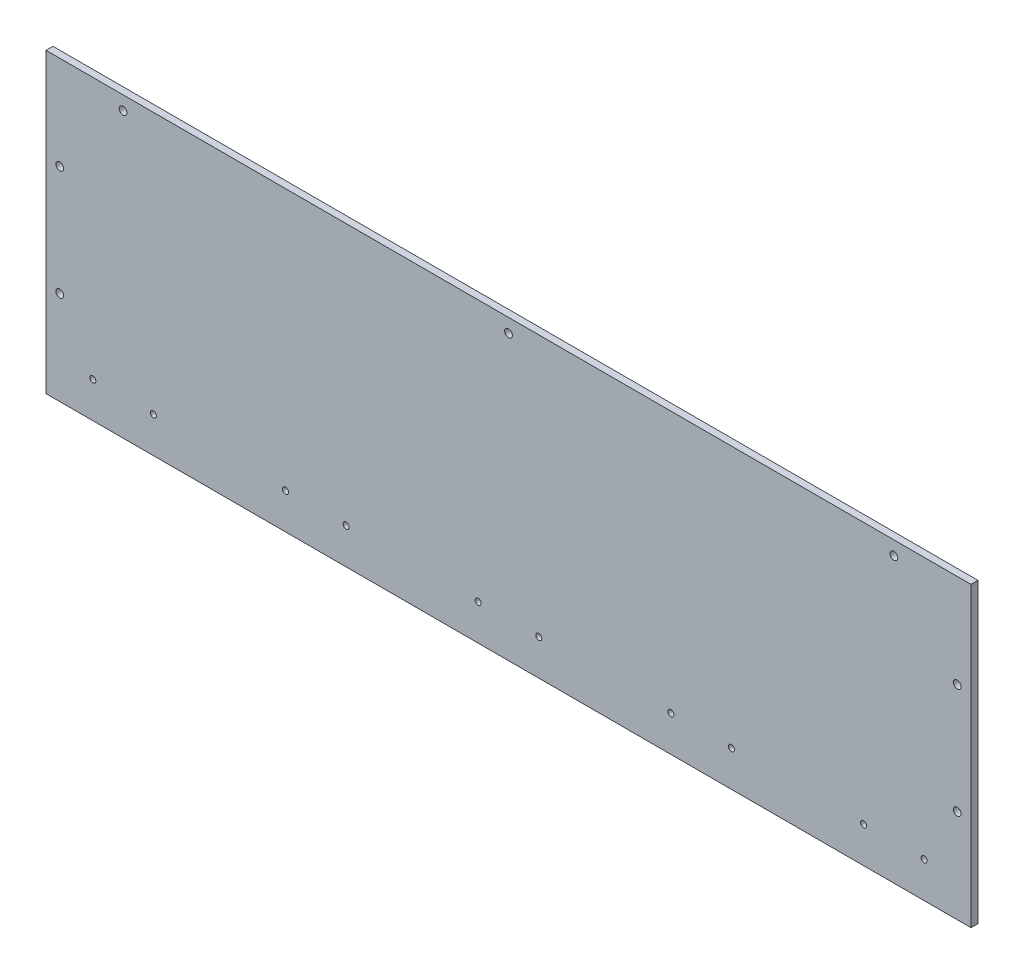
ISO-10303-21;
HEADER;
FILE_DESCRIPTION(('STEP AP214'),'2;1');
FILE_NAME('part.step','',(''),(''),'','','');
FILE_SCHEMA(('AUTOMOTIVE_DESIGN { 1 0 10303 214 1 1 1 1 }'));
ENDSEC;
DATA;
#1=APPLICATION_CONTEXT('core data for automotive mechanical design processes');
#2=APPLICATION_PROTOCOL_DEFINITION('international standard','automotive_design',2000,#1);
#3=PRODUCT_CONTEXT('',#1,'mechanical');
#4=PRODUCT('Part','Part','',(#3));
#5=PRODUCT_RELATED_PRODUCT_CATEGORY('part','',(#4));
#6=PRODUCT_DEFINITION_FORMATION('','',#4);
#7=PRODUCT_DEFINITION_CONTEXT('part definition',#1,'design');
#8=PRODUCT_DEFINITION('design','',#6,#7);
#9=PRODUCT_DEFINITION_SHAPE('','',#8);
#10=(LENGTH_UNIT() NAMED_UNIT(*) SI_UNIT(.MILLI.,.METRE.));
#11=(NAMED_UNIT(*) PLANE_ANGLE_UNIT() SI_UNIT($,.RADIAN.));
#12=(NAMED_UNIT(*) SI_UNIT($,.STERADIAN.) SOLID_ANGLE_UNIT());
#13=UNCERTAINTY_MEASURE_WITH_UNIT(LENGTH_MEASURE(1.E-05),#10,'distance_accuracy_value','');
#14=(GEOMETRIC_REPRESENTATION_CONTEXT(3) GLOBAL_UNCERTAINTY_ASSIGNED_CONTEXT((#13)) GLOBAL_UNIT_ASSIGNED_CONTEXT((#10,
#11,#12)) REPRESENTATION_CONTEXT('',''));
#15=CARTESIAN_POINT('',(0.,0.,0.));
#16=DIRECTION('',(0.,0.,1.));
#17=DIRECTION('',(1.,0.,0.));
#18=AXIS2_PLACEMENT_3D('',#15,#16,#17);
#19=CARTESIAN_POINT('',(0.,0.,6.35));
#20=DIRECTION('',(0.,0.,-1.));
#21=DIRECTION('',(-1.,0.,0.));
#22=AXIS2_PLACEMENT_3D('',#19,#20,#21);
#23=PLANE('',#22);
#24=CARTESIAN_POINT('',(420.,257.5,6.35));
#25=DIRECTION('',(0.,0.,-1.));
#26=DIRECTION('',(-1.,0.,0.));
#27=AXIS2_PLACEMENT_3D('',#24,#25,#26);
#28=CIRCLE('',#27,3.50000000000002);
#29=CARTESIAN_POINT('',(416.5,257.5,6.35));
#30=VERTEX_POINT('',#29);
#31=EDGE_CURVE('E103',#30,#30,#28,.T.);
#32=ORIENTED_EDGE('',*,*,#31,.T.);
#33=EDGE_LOOP('',(#32));
#34=FACE_BOUND('',#33,.T.);
#35=CARTESIAN_POINT('',(770.,257.5,6.35));
#36=DIRECTION('',(0.,0.,-1.));
#37=DIRECTION('',(-1.,0.,0.));
#38=AXIS2_PLACEMENT_3D('',#35,#36,#37);
#39=CIRCLE('',#38,3.49999999999997);
#40=CARTESIAN_POINT('',(766.5,257.5,6.35));
#41=VERTEX_POINT('',#40);
#42=EDGE_CURVE('E117',#41,#41,#39,.T.);
#43=ORIENTED_EDGE('',*,*,#42,.T.);
#44=EDGE_LOOP('',(#43));
#45=FACE_BOUND('',#44,.T.);
#46=CARTESIAN_POINT('',(12.5,185.,6.35));
#47=DIRECTION('',(0.,0.,-1.));
#48=DIRECTION('',(-1.,0.,0.));
#49=AXIS2_PLACEMENT_3D('',#46,#47,#48);
#50=CIRCLE('',#49,3.5);
#51=CARTESIAN_POINT('',(9.00000000000001,185.,6.35));
#52=VERTEX_POINT('',#51);
#53=EDGE_CURVE('E120',#52,#52,#50,.T.);
#54=ORIENTED_EDGE('',*,*,#53,.T.);
#55=EDGE_LOOP('',(#54));
#56=FACE_BOUND('',#55,.T.);
#57=CARTESIAN_POINT('',(12.5,85.,6.35));
#58=DIRECTION('',(0.,0.,-1.));
#59=DIRECTION('',(-1.,0.,0.));
#60=AXIS2_PLACEMENT_3D('',#57,#58,#59);
#61=CIRCLE('',#60,3.5);
#62=CARTESIAN_POINT('',(9.00000000000004,85.,6.35));
#63=VERTEX_POINT('',#62);
#64=EDGE_CURVE('E123',#63,#63,#61,.T.);
#65=ORIENTED_EDGE('',*,*,#64,.T.);
#66=EDGE_LOOP('',(#65));
#67=FACE_BOUND('',#66,.T.);
#68=CARTESIAN_POINT('',(392.5,32.5,6.35));
#69=DIRECTION('',(0.,0.,-1.));
#70=DIRECTION('',(-1.,0.,0.));
#71=AXIS2_PLACEMENT_3D('',#68,#69,#70);
#72=CIRCLE('',#71,2.74999999999998);
#73=CARTESIAN_POINT('',(389.75,32.5,6.35));
#74=VERTEX_POINT('',#73);
#75=EDGE_CURVE('E126',#74,#74,#72,.T.);
#76=ORIENTED_EDGE('',*,*,#75,.T.);
#77=EDGE_LOOP('',(#76));
#78=FACE_BOUND('',#77,.T.);
#79=CARTESIAN_POINT('',(447.5,32.5,6.35));
#80=DIRECTION('',(0.,0.,-1.));
#81=DIRECTION('',(-1.,0.,0.));
#82=AXIS2_PLACEMENT_3D('',#79,#80,#81);
#83=CIRCLE('',#82,2.74999999999998);
#84=CARTESIAN_POINT('',(444.75,32.5,6.35));
#85=VERTEX_POINT('',#84);
#86=EDGE_CURVE('E129',#85,#85,#83,.T.);
#87=ORIENTED_EDGE('',*,*,#86,.T.);
#88=EDGE_LOOP('',(#87));
#89=FACE_BOUND('',#88,.T.);
#90=CARTESIAN_POINT('',(567.5,32.5,6.35));
#91=DIRECTION('',(0.,0.,-1.));
#92=DIRECTION('',(-1.,0.,0.));
#93=AXIS2_PLACEMENT_3D('',#90,#91,#92);
#94=CIRCLE('',#93,2.75000000000004);
#95=CARTESIAN_POINT('',(564.75,32.5,6.35));
#96=VERTEX_POINT('',#95);
#97=EDGE_CURVE('E132',#96,#96,#94,.T.);
#98=ORIENTED_EDGE('',*,*,#97,.T.);
#99=EDGE_LOOP('',(#98));
#100=FACE_BOUND('',#99,.T.);
#101=CARTESIAN_POINT('',(622.5,32.5,6.35));
#102=DIRECTION('',(0.,0.,-1.));
#103=DIRECTION('',(-1.,0.,0.));
#104=AXIS2_PLACEMENT_3D('',#101,#102,#103);
#105=CIRCLE('',#104,2.74999999999992);
#106=CARTESIAN_POINT('',(619.75,32.5,6.35));
#107=VERTEX_POINT('',#106);
#108=EDGE_CURVE('E135',#107,#107,#105,.T.);
#109=ORIENTED_EDGE('',*,*,#108,.T.);
#110=EDGE_LOOP('',(#109));
#111=FACE_BOUND('',#110,.T.);
#112=CARTESIAN_POINT('',(742.5,32.5,6.35));
#113=DIRECTION('',(0.,0.,-1.));
#114=DIRECTION('',(-1.,0.,0.));
#115=AXIS2_PLACEMENT_3D('',#112,#113,#114);
#116=CIRCLE('',#115,2.75000000000004);
#117=CARTESIAN_POINT('',(739.75,32.5,6.35));
#118=VERTEX_POINT('',#117);
#119=EDGE_CURVE('E138',#118,#118,#116,.T.);
#120=ORIENTED_EDGE('',*,*,#119,.T.);
#121=EDGE_LOOP('',(#120));
#122=FACE_BOUND('',#121,.T.);
#123=CARTESIAN_POINT('',(797.5,32.5,6.35));
#124=DIRECTION('',(0.,0.,-1.));
#125=DIRECTION('',(-1.,0.,0.));
#126=AXIS2_PLACEMENT_3D('',#123,#124,#125);
#127=CIRCLE('',#126,2.74999999999992);
#128=CARTESIAN_POINT('',(794.75,32.5,6.35));
#129=VERTEX_POINT('',#128);
#130=EDGE_CURVE('E141',#129,#129,#127,.T.);
#131=ORIENTED_EDGE('',*,*,#130,.T.);
#132=EDGE_LOOP('',(#131));
#133=FACE_BOUND('',#132,.T.);
#134=CARTESIAN_POINT('',(217.5,32.4999999999988,6.35));
#135=DIRECTION('',(0.,0.,-1.));
#136=DIRECTION('',(-1.,0.,0.));
#137=AXIS2_PLACEMENT_3D('',#134,#135,#136);
#138=CIRCLE('',#137,2.74999999999998);
#139=CARTESIAN_POINT('',(214.75,32.4999999999988,6.35));
#140=VERTEX_POINT('',#139);
#141=EDGE_CURVE('E144',#140,#140,#138,.T.);
#142=ORIENTED_EDGE('',*,*,#141,.T.);
#143=EDGE_LOOP('',(#142));
#144=FACE_BOUND('',#143,.T.);
#145=CARTESIAN_POINT('',(272.5,32.4999999999988,6.35));
#146=DIRECTION('',(0.,0.,-1.));
#147=DIRECTION('',(-1.,0.,0.));
#148=AXIS2_PLACEMENT_3D('',#145,#146,#147);
#149=CIRCLE('',#148,2.74999999999998);
#150=CARTESIAN_POINT('',(269.75,32.4999999999988,6.35));
#151=VERTEX_POINT('',#150);
#152=EDGE_CURVE('E147',#151,#151,#149,.T.);
#153=ORIENTED_EDGE('',*,*,#152,.T.);
#154=EDGE_LOOP('',(#153));
#155=FACE_BOUND('',#154,.T.);
#156=CARTESIAN_POINT('',(42.5,32.4999999999976,6.35));
#157=DIRECTION('',(0.,0.,-1.));
#158=DIRECTION('',(-1.,0.,0.));
#159=AXIS2_PLACEMENT_3D('',#156,#157,#158);
#160=CIRCLE('',#159,2.74999999999998);
#161=CARTESIAN_POINT('',(39.7500000000001,32.4999999999976,6.35));
#162=VERTEX_POINT('',#161);
#163=EDGE_CURVE('E150',#162,#162,#160,.T.);
#164=ORIENTED_EDGE('',*,*,#163,.T.);
#165=EDGE_LOOP('',(#164));
#166=FACE_BOUND('',#165,.T.);
#167=CARTESIAN_POINT('',(97.5000000000001,32.4999999999976,6.35));
#168=DIRECTION('',(0.,0.,-1.));
#169=DIRECTION('',(-1.,0.,0.));
#170=AXIS2_PLACEMENT_3D('',#167,#168,#169);
#171=CIRCLE('',#170,2.74999999999998);
#172=CARTESIAN_POINT('',(94.7500000000001,32.4999999999976,6.35));
#173=VERTEX_POINT('',#172);
#174=EDGE_CURVE('E153',#173,#173,#171,.T.);
#175=ORIENTED_EDGE('',*,*,#174,.T.);
#176=EDGE_LOOP('',(#175));
#177=FACE_BOUND('',#176,.T.);
#178=CARTESIAN_POINT('',(70.,257.5,6.35));
#179=DIRECTION('',(0.,0.,-1.));
#180=DIRECTION('',(-1.,0.,0.));
#181=AXIS2_PLACEMENT_3D('',#178,#179,#180);
#182=CIRCLE('',#181,3.50000000000001);
#183=CARTESIAN_POINT('',(66.5,257.5,6.35));
#184=VERTEX_POINT('',#183);
#185=EDGE_CURVE('E156',#184,#184,#182,.T.);
#186=ORIENTED_EDGE('',*,*,#185,.T.);
#187=EDGE_LOOP('',(#186));
#188=FACE_BOUND('',#187,.T.);
#189=DIRECTION('',(0.,-1.,0.));
#190=VECTOR('',#189,1.);
#191=CARTESIAN_POINT('',(0.,0.,6.35));
#192=LINE('',#191,#190);
#193=CARTESIAN_POINT('',(0.,270.,6.35));
#194=VERTEX_POINT('',#193);
#195=CARTESIAN_POINT('',(0.,0.,6.35));
#196=VERTEX_POINT('',#195);
#197=EDGE_CURVE('E88',#194,#196,#192,.T.);
#198=ORIENTED_EDGE('',*,*,#197,.T.);
#199=DIRECTION('',(1.,0.,0.));
#200=VECTOR('',#199,1.);
#201=CARTESIAN_POINT('',(0.,0.,6.35));
#202=LINE('',#201,#200);
#203=CARTESIAN_POINT('',(840.,0.,6.35));
#204=VERTEX_POINT('',#203);
#205=EDGE_CURVE('E83',#196,#204,#202,.T.);
#206=ORIENTED_EDGE('',*,*,#205,.T.);
#207=DIRECTION('',(0.,1.,0.));
#208=VECTOR('',#207,1.);
#209=CARTESIAN_POINT('',(840.,0.,6.35));
#210=LINE('',#209,#208);
#211=CARTESIAN_POINT('',(840.,270.,6.35));
#212=VERTEX_POINT('',#211);
#213=EDGE_CURVE('E86',#204,#212,#210,.T.);
#214=ORIENTED_EDGE('',*,*,#213,.T.);
#215=DIRECTION('',(-1.,0.,0.));
#216=VECTOR('',#215,1.);
#217=CARTESIAN_POINT('',(0.,270.,6.35));
#218=LINE('',#217,#216);
#219=EDGE_CURVE('E53',#212,#194,#218,.T.);
#220=ORIENTED_EDGE('',*,*,#219,.T.);
#221=EDGE_LOOP('',(#198,#206,#214,#220));
#222=FACE_BOUND('',#221,.T.);
#223=CARTESIAN_POINT('',(827.5,85.,6.35));
#224=DIRECTION('',(0.,0.,-1.));
#225=DIRECTION('',(-1.,0.,0.));
#226=AXIS2_PLACEMENT_3D('',#223,#224,#225);
#227=CIRCLE('',#226,3.5);
#228=CARTESIAN_POINT('',(824.,85.,6.35));
#229=VERTEX_POINT('',#228);
#230=EDGE_CURVE('E207',#229,#229,#227,.F.);
#231=ORIENTED_EDGE('',*,*,#230,.F.);
#232=EDGE_LOOP('',(#231));
#233=FACE_BOUND('',#232,.T.);
#234=CARTESIAN_POINT('',(827.5,185.,6.35));
#235=DIRECTION('',(0.,0.,-1.));
#236=DIRECTION('',(-1.,0.,0.));
#237=AXIS2_PLACEMENT_3D('',#234,#235,#236);
#238=CIRCLE('',#237,3.5);
#239=CARTESIAN_POINT('',(824.,185.,6.35));
#240=VERTEX_POINT('',#239);
#241=EDGE_CURVE('E191',#240,#240,#238,.F.);
#242=ORIENTED_EDGE('',*,*,#241,.F.);
#243=EDGE_LOOP('',(#242));
#244=FACE_BOUND('',#243,.T.);
#245=ADVANCED_FACE('F36',(#34,#45,#56,#67,#78,#89,#100,#111,#122,#133,#144,#155,#166,#177,#188,
#222,#233,#244),#23,.F.);
#246=CARTESIAN_POINT('',(0.,0.,0.));
#247=DIRECTION('',(0.,0.,-1.));
#248=DIRECTION('',(-1.,0.,0.));
#249=AXIS2_PLACEMENT_3D('',#246,#247,#248);
#250=PLANE('',#249);
#251=CARTESIAN_POINT('',(827.5,85.,0.));
#252=DIRECTION('',(0.,0.,-1.));
#253=DIRECTION('',(-1.,0.,0.));
#254=AXIS2_PLACEMENT_3D('',#251,#252,#253);
#255=CIRCLE('',#254,3.5);
#256=CARTESIAN_POINT('',(824.,85.,0.));
#257=VERTEX_POINT('',#256);
#258=EDGE_CURVE('E211',#257,#257,#255,.T.);
#259=ORIENTED_EDGE('',*,*,#258,.F.);
#260=EDGE_LOOP('',(#259));
#261=FACE_BOUND('',#260,.T.);
#262=CARTESIAN_POINT('',(420.,257.5,0.));
#263=DIRECTION('',(0.,0.,1.));
#264=DIRECTION('',(1.,0.,0.));
#265=AXIS2_PLACEMENT_3D('',#262,#263,#264);
#266=CIRCLE('',#265,3.50000000000002);
#267=CARTESIAN_POINT('',(423.5,257.5,0.));
#268=VERTEX_POINT('',#267);
#269=EDGE_CURVE('E162',#268,#268,#266,.T.);
#270=ORIENTED_EDGE('',*,*,#269,.T.);
#271=EDGE_LOOP('',(#270));
#272=FACE_BOUND('',#271,.T.);
#273=CARTESIAN_POINT('',(770.,257.5,0.));
#274=DIRECTION('',(0.,0.,1.));
#275=DIRECTION('',(1.,0.,0.));
#276=AXIS2_PLACEMENT_3D('',#273,#274,#275);
#277=CIRCLE('',#276,3.49999999999997);
#278=CARTESIAN_POINT('',(773.5,257.5,0.));
#279=VERTEX_POINT('',#278);
#280=EDGE_CURVE('E182',#279,#279,#277,.T.);
#281=ORIENTED_EDGE('',*,*,#280,.T.);
#282=EDGE_LOOP('',(#281));
#283=FACE_BOUND('',#282,.T.);
#284=CARTESIAN_POINT('',(12.5,185.,0.));
#285=DIRECTION('',(0.,0.,1.));
#286=DIRECTION('',(1.,0.,0.));
#287=AXIS2_PLACEMENT_3D('',#284,#285,#286);
#288=CIRCLE('',#287,3.5);
#289=CARTESIAN_POINT('',(16.,185.,0.));
#290=VERTEX_POINT('',#289);
#291=EDGE_CURVE('E179',#290,#290,#288,.T.);
#292=ORIENTED_EDGE('',*,*,#291,.T.);
#293=EDGE_LOOP('',(#292));
#294=FACE_BOUND('',#293,.T.);
#295=CARTESIAN_POINT('',(12.5,85.,0.));
#296=DIRECTION('',(0.,0.,1.));
#297=DIRECTION('',(1.,0.,0.));
#298=AXIS2_PLACEMENT_3D('',#295,#296,#297);
#299=CIRCLE('',#298,3.5);
#300=CARTESIAN_POINT('',(16.,85.,0.));
#301=VERTEX_POINT('',#300);
#302=EDGE_CURVE('E176',#301,#301,#299,.T.);
#303=ORIENTED_EDGE('',*,*,#302,.T.);
#304=EDGE_LOOP('',(#303));
#305=FACE_BOUND('',#304,.T.);
#306=CARTESIAN_POINT('',(392.5,32.5,0.));
#307=DIRECTION('',(0.,0.,1.));
#308=DIRECTION('',(1.,0.,0.));
#309=AXIS2_PLACEMENT_3D('',#306,#307,#308);
#310=CIRCLE('',#309,2.74999999999998);
#311=CARTESIAN_POINT('',(395.25,32.5,0.));
#312=VERTEX_POINT('',#311);
#313=EDGE_CURVE('E173',#312,#312,#310,.T.);
#314=ORIENTED_EDGE('',*,*,#313,.T.);
#315=EDGE_LOOP('',(#314));
#316=FACE_BOUND('',#315,.T.);
#317=CARTESIAN_POINT('',(447.5,32.5,0.));
#318=DIRECTION('',(0.,0.,1.));
#319=DIRECTION('',(1.,0.,0.));
#320=AXIS2_PLACEMENT_3D('',#317,#318,#319);
#321=CIRCLE('',#320,2.74999999999998);
#322=CARTESIAN_POINT('',(450.25,32.5,0.));
#323=VERTEX_POINT('',#322);
#324=EDGE_CURVE('E170',#323,#323,#321,.T.);
#325=ORIENTED_EDGE('',*,*,#324,.T.);
#326=EDGE_LOOP('',(#325));
#327=FACE_BOUND('',#326,.T.);
#328=CARTESIAN_POINT('',(567.5,32.5,0.));
#329=DIRECTION('',(0.,0.,1.));
#330=DIRECTION('',(1.,0.,0.));
#331=AXIS2_PLACEMENT_3D('',#328,#329,#330);
#332=CIRCLE('',#331,2.75000000000004);
#333=CARTESIAN_POINT('',(570.25,32.5,0.));
#334=VERTEX_POINT('',#333);
#335=EDGE_CURVE('E166',#334,#334,#332,.T.);
#336=ORIENTED_EDGE('',*,*,#335,.T.);
#337=EDGE_LOOP('',(#336));
#338=FACE_BOUND('',#337,.T.);
#339=CARTESIAN_POINT('',(622.5,32.5,0.));
#340=DIRECTION('',(0.,0.,1.));
#341=DIRECTION('',(1.,0.,0.));
#342=AXIS2_PLACEMENT_3D('',#339,#340,#341);
#343=CIRCLE('',#342,2.74999999999992);
#344=CARTESIAN_POINT('',(625.25,32.5,0.));
#345=VERTEX_POINT('',#344);
#346=EDGE_CURVE('E163',#345,#345,#343,.T.);
#347=ORIENTED_EDGE('',*,*,#346,.T.);
#348=EDGE_LOOP('',(#347));
#349=FACE_BOUND('',#348,.T.);
#350=CARTESIAN_POINT('',(742.5,32.5,0.));
#351=DIRECTION('',(0.,0.,1.));
#352=DIRECTION('',(1.,0.,0.));
#353=AXIS2_PLACEMENT_3D('',#350,#351,#352);
#354=CIRCLE('',#353,2.75000000000004);
#355=CARTESIAN_POINT('',(745.25,32.5,0.));
#356=VERTEX_POINT('',#355);
#357=EDGE_CURVE('E167',#356,#356,#354,.T.);
#358=ORIENTED_EDGE('',*,*,#357,.T.);
#359=EDGE_LOOP('',(#358));
#360=FACE_BOUND('',#359,.T.);
#361=CARTESIAN_POINT('',(797.5,32.5,0.));
#362=DIRECTION('',(0.,0.,1.));
#363=DIRECTION('',(1.,0.,0.));
#364=AXIS2_PLACEMENT_3D('',#361,#362,#363);
#365=CIRCLE('',#364,2.74999999999992);
#366=CARTESIAN_POINT('',(800.25,32.5,0.));
#367=VERTEX_POINT('',#366);
#368=EDGE_CURVE('E200',#367,#367,#365,.T.);
#369=ORIENTED_EDGE('',*,*,#368,.T.);
#370=EDGE_LOOP('',(#369));
#371=FACE_BOUND('',#370,.T.);
#372=CARTESIAN_POINT('',(217.5,32.4999999999988,0.));
#373=DIRECTION('',(0.,0.,1.));
#374=DIRECTION('',(1.,0.,0.));
#375=AXIS2_PLACEMENT_3D('',#372,#373,#374);
#376=CIRCLE('',#375,2.74999999999998);
#377=CARTESIAN_POINT('',(220.25,32.4999999999988,0.));
#378=VERTEX_POINT('',#377);
#379=EDGE_CURVE('E197',#378,#378,#376,.T.);
#380=ORIENTED_EDGE('',*,*,#379,.T.);
#381=EDGE_LOOP('',(#380));
#382=FACE_BOUND('',#381,.T.);
#383=CARTESIAN_POINT('',(272.5,32.4999999999988,0.));
#384=DIRECTION('',(0.,0.,1.));
#385=DIRECTION('',(1.,0.,0.));
#386=AXIS2_PLACEMENT_3D('',#383,#384,#385);
#387=CIRCLE('',#386,2.74999999999998);
#388=CARTESIAN_POINT('',(275.25,32.4999999999988,0.));
#389=VERTEX_POINT('',#388);
#390=EDGE_CURVE('E194',#389,#389,#387,.T.);
#391=ORIENTED_EDGE('',*,*,#390,.T.);
#392=EDGE_LOOP('',(#391));
#393=FACE_BOUND('',#392,.T.);
#394=CARTESIAN_POINT('',(42.5,32.4999999999976,0.));
#395=DIRECTION('',(0.,0.,1.));
#396=DIRECTION('',(1.,0.,0.));
#397=AXIS2_PLACEMENT_3D('',#394,#395,#396);
#398=CIRCLE('',#397,2.74999999999998);
#399=CARTESIAN_POINT('',(45.25,32.4999999999976,0.));
#400=VERTEX_POINT('',#399);
#401=EDGE_CURVE('E190',#400,#400,#398,.T.);
#402=ORIENTED_EDGE('',*,*,#401,.T.);
#403=EDGE_LOOP('',(#402));
#404=FACE_BOUND('',#403,.T.);
#405=CARTESIAN_POINT('',(97.5000000000001,32.4999999999976,0.));
#406=DIRECTION('',(0.,0.,1.));
#407=DIRECTION('',(1.,0.,0.));
#408=AXIS2_PLACEMENT_3D('',#405,#406,#407);
#409=CIRCLE('',#408,2.74999999999998);
#410=CARTESIAN_POINT('',(100.25,32.4999999999976,0.));
#411=VERTEX_POINT('',#410);
#412=EDGE_CURVE('E187',#411,#411,#409,.T.);
#413=ORIENTED_EDGE('',*,*,#412,.T.);
#414=EDGE_LOOP('',(#413));
#415=FACE_BOUND('',#414,.T.);
#416=CARTESIAN_POINT('',(70.,257.5,0.));
#417=DIRECTION('',(0.,0.,1.));
#418=DIRECTION('',(1.,0.,0.));
#419=AXIS2_PLACEMENT_3D('',#416,#417,#418);
#420=CIRCLE('',#419,3.50000000000001);
#421=CARTESIAN_POINT('',(73.5,257.5,0.));
#422=VERTEX_POINT('',#421);
#423=EDGE_CURVE('E159',#422,#422,#420,.T.);
#424=ORIENTED_EDGE('',*,*,#423,.T.);
#425=EDGE_LOOP('',(#424));
#426=FACE_BOUND('',#425,.T.);
#427=DIRECTION('',(0.,-1.,0.));
#428=VECTOR('',#427,1.);
#429=CARTESIAN_POINT('',(0.,0.,0.));
#430=LINE('',#429,#428);
#431=CARTESIAN_POINT('',(0.,270.,0.));
#432=VERTEX_POINT('',#431);
#433=CARTESIAN_POINT('',(0.,0.,0.));
#434=VERTEX_POINT('',#433);
#435=EDGE_CURVE('E100',#432,#434,#430,.T.);
#436=ORIENTED_EDGE('',*,*,#435,.F.);
#437=DIRECTION('',(-1.,0.,0.));
#438=VECTOR('',#437,1.);
#439=CARTESIAN_POINT('',(0.,270.,0.));
#440=LINE('',#439,#438);
#441=CARTESIAN_POINT('',(840.,270.,0.));
#442=VERTEX_POINT('',#441);
#443=EDGE_CURVE('E76',#442,#432,#440,.T.);
#444=ORIENTED_EDGE('',*,*,#443,.F.);
#445=DIRECTION('',(0.,1.,0.));
#446=VECTOR('',#445,1.);
#447=CARTESIAN_POINT('',(840.,0.,0.));
#448=LINE('',#447,#446);
#449=CARTESIAN_POINT('',(840.,0.,0.));
#450=VERTEX_POINT('',#449);
#451=EDGE_CURVE('E70',#450,#442,#448,.T.);
#452=ORIENTED_EDGE('',*,*,#451,.F.);
#453=DIRECTION('',(1.,0.,0.));
#454=VECTOR('',#453,1.);
#455=CARTESIAN_POINT('',(0.,0.,0.));
#456=LINE('',#455,#454);
#457=EDGE_CURVE('E92',#434,#450,#456,.T.);
#458=ORIENTED_EDGE('',*,*,#457,.F.);
#459=EDGE_LOOP('',(#436,#444,#452,#458));
#460=FACE_BOUND('',#459,.T.);
#461=CARTESIAN_POINT('',(827.5,185.,0.));
#462=DIRECTION('',(0.,0.,-1.));
#463=DIRECTION('',(-1.,0.,0.));
#464=AXIS2_PLACEMENT_3D('',#461,#462,#463);
#465=CIRCLE('',#464,3.5);
#466=CARTESIAN_POINT('',(824.,185.,0.));
#467=VERTEX_POINT('',#466);
#468=EDGE_CURVE('E210',#467,#467,#465,.T.);
#469=ORIENTED_EDGE('',*,*,#468,.F.);
#470=EDGE_LOOP('',(#469));
#471=FACE_BOUND('',#470,.T.);
#472=ADVANCED_FACE('F111',(#261,#272,#283,#294,#305,#316,#327,#338,#349,#360,#371,#382,#393,
#404,#415,#426,#460,#471),#250,.T.);
#473=CARTESIAN_POINT('',(0.,0.,6.35));
#474=DIRECTION('',(1.,0.,0.));
#475=DIRECTION('',(0.,0.,-1.));
#476=AXIS2_PLACEMENT_3D('',#473,#474,#475);
#477=PLANE('',#476);
#478=ORIENTED_EDGE('',*,*,#435,.T.);
#479=DIRECTION('',(0.,0.,-1.));
#480=VECTOR('',#479,1.);
#481=CARTESIAN_POINT('',(0.,0.,6.35));
#482=LINE('',#481,#480);
#483=EDGE_CURVE('E11',#196,#434,#482,.T.);
#484=ORIENTED_EDGE('',*,*,#483,.F.);
#485=ORIENTED_EDGE('',*,*,#197,.F.);
#486=DIRECTION('',(0.,0.,-1.));
#487=VECTOR('',#486,1.);
#488=CARTESIAN_POINT('',(0.,270.,6.35));
#489=LINE('',#488,#487);
#490=EDGE_CURVE('E96',#194,#432,#489,.T.);
#491=ORIENTED_EDGE('',*,*,#490,.T.);
#492=EDGE_LOOP('',(#478,#484,#485,#491));
#493=FACE_BOUND('',#492,.T.);
#494=ADVANCED_FACE('F38',(#493),#477,.F.);
#495=CARTESIAN_POINT('',(0.,0.,6.35));
#496=DIRECTION('',(0.,1.,0.));
#497=DIRECTION('',(0.,0.,1.));
#498=AXIS2_PLACEMENT_3D('',#495,#496,#497);
#499=PLANE('',#498);
#500=ORIENTED_EDGE('',*,*,#457,.T.);
#501=DIRECTION('',(0.,0.,-1.));
#502=VECTOR('',#501,1.);
#503=CARTESIAN_POINT('',(840.,0.,6.35));
#504=LINE('',#503,#502);
#505=EDGE_CURVE('E45',#204,#450,#504,.T.);
#506=ORIENTED_EDGE('',*,*,#505,.F.);
#507=ORIENTED_EDGE('',*,*,#205,.F.);
#508=ORIENTED_EDGE('',*,*,#483,.T.);
#509=EDGE_LOOP('',(#500,#506,#507,#508));
#510=FACE_BOUND('',#509,.T.);
#511=ADVANCED_FACE('F91',(#510),#499,.F.);
#512=CARTESIAN_POINT('',(840.,0.,6.35));
#513=DIRECTION('',(-1.,0.,0.));
#514=DIRECTION('',(0.,0.,1.));
#515=AXIS2_PLACEMENT_3D('',#512,#513,#514);
#516=PLANE('',#515);
#517=ORIENTED_EDGE('',*,*,#451,.T.);
#518=DIRECTION('',(0.,0.,-1.));
#519=VECTOR('',#518,1.);
#520=CARTESIAN_POINT('',(840.,270.,6.35));
#521=LINE('',#520,#519);
#522=EDGE_CURVE('E93',#212,#442,#521,.T.);
#523=ORIENTED_EDGE('',*,*,#522,.F.);
#524=ORIENTED_EDGE('',*,*,#213,.F.);
#525=ORIENTED_EDGE('',*,*,#505,.T.);
#526=EDGE_LOOP('',(#517,#523,#524,#525));
#527=FACE_BOUND('',#526,.T.);
#528=ADVANCED_FACE('F94',(#527),#516,.F.);
#529=CARTESIAN_POINT('',(0.,270.,6.35));
#530=DIRECTION('',(0.,-1.,0.));
#531=DIRECTION('',(0.,0.,-1.));
#532=AXIS2_PLACEMENT_3D('',#529,#530,#531);
#533=PLANE('',#532);
#534=ORIENTED_EDGE('',*,*,#443,.T.);
#535=ORIENTED_EDGE('',*,*,#490,.F.);
#536=ORIENTED_EDGE('',*,*,#219,.F.);
#537=ORIENTED_EDGE('',*,*,#522,.T.);
#538=EDGE_LOOP('',(#534,#535,#536,#537));
#539=FACE_BOUND('',#538,.T.);
#540=ADVANCED_FACE('F108',(#539),#533,.F.);
#541=CARTESIAN_POINT('',(70.,257.5,0.));
#542=DIRECTION('',(0.,0.,1.));
#543=DIRECTION('',(1.,0.,0.));
#544=AXIS2_PLACEMENT_3D('',#541,#542,#543);
#545=CYLINDRICAL_SURFACE('',#544,3.50000000000001);
#546=ORIENTED_EDGE('',*,*,#423,.F.);
#547=EDGE_LOOP('',(#546));
#548=FACE_BOUND('',#547,.T.);
#549=ORIENTED_EDGE('',*,*,#185,.F.);
#550=EDGE_LOOP('',(#549));
#551=FACE_BOUND('',#550,.T.);
#552=ADVANCED_FACE('F234',(#548,#551),#545,.F.);
#553=CARTESIAN_POINT('',(97.5000000000001,32.4999999999976,0.));
#554=DIRECTION('',(0.,0.,1.));
#555=DIRECTION('',(1.,0.,0.));
#556=AXIS2_PLACEMENT_3D('',#553,#554,#555);
#557=CYLINDRICAL_SURFACE('',#556,2.74999999999998);
#558=ORIENTED_EDGE('',*,*,#412,.F.);
#559=EDGE_LOOP('',(#558));
#560=FACE_BOUND('',#559,.T.);
#561=ORIENTED_EDGE('',*,*,#174,.F.);
#562=EDGE_LOOP('',(#561));
#563=FACE_BOUND('',#562,.T.);
#564=ADVANCED_FACE('F255',(#560,#563),#557,.F.);
#565=CARTESIAN_POINT('',(42.5,32.4999999999976,0.));
#566=DIRECTION('',(0.,0.,1.));
#567=DIRECTION('',(1.,0.,0.));
#568=AXIS2_PLACEMENT_3D('',#565,#566,#567);
#569=CYLINDRICAL_SURFACE('',#568,2.74999999999998);
#570=ORIENTED_EDGE('',*,*,#401,.F.);
#571=EDGE_LOOP('',(#570));
#572=FACE_BOUND('',#571,.T.);
#573=ORIENTED_EDGE('',*,*,#163,.F.);
#574=EDGE_LOOP('',(#573));
#575=FACE_BOUND('',#574,.T.);
#576=ADVANCED_FACE('F262',(#572,#575),#569,.F.);
#577=CARTESIAN_POINT('',(272.5,32.4999999999988,0.));
#578=DIRECTION('',(0.,0.,1.));
#579=DIRECTION('',(1.,0.,0.));
#580=AXIS2_PLACEMENT_3D('',#577,#578,#579);
#581=CYLINDRICAL_SURFACE('',#580,2.74999999999998);
#582=ORIENTED_EDGE('',*,*,#390,.F.);
#583=EDGE_LOOP('',(#582));
#584=FACE_BOUND('',#583,.T.);
#585=ORIENTED_EDGE('',*,*,#152,.F.);
#586=EDGE_LOOP('',(#585));
#587=FACE_BOUND('',#586,.T.);
#588=ADVANCED_FACE('F270',(#584,#587),#581,.F.);
#589=CARTESIAN_POINT('',(217.5,32.4999999999988,0.));
#590=DIRECTION('',(0.,0.,1.));
#591=DIRECTION('',(1.,0.,0.));
#592=AXIS2_PLACEMENT_3D('',#589,#590,#591);
#593=CYLINDRICAL_SURFACE('',#592,2.74999999999998);
#594=ORIENTED_EDGE('',*,*,#379,.F.);
#595=EDGE_LOOP('',(#594));
#596=FACE_BOUND('',#595,.T.);
#597=ORIENTED_EDGE('',*,*,#141,.F.);
#598=EDGE_LOOP('',(#597));
#599=FACE_BOUND('',#598,.T.);
#600=ADVANCED_FACE('F278',(#596,#599),#593,.F.);
#601=CARTESIAN_POINT('',(797.5,32.5,0.));
#602=DIRECTION('',(0.,0.,1.));
#603=DIRECTION('',(1.,0.,0.));
#604=AXIS2_PLACEMENT_3D('',#601,#602,#603);
#605=CYLINDRICAL_SURFACE('',#604,2.74999999999992);
#606=ORIENTED_EDGE('',*,*,#368,.F.);
#607=EDGE_LOOP('',(#606));
#608=FACE_BOUND('',#607,.T.);
#609=ORIENTED_EDGE('',*,*,#130,.F.);
#610=EDGE_LOOP('',(#609));
#611=FACE_BOUND('',#610,.T.);
#612=ADVANCED_FACE('F286',(#608,#611),#605,.F.);
#613=CARTESIAN_POINT('',(742.5,32.5,0.));
#614=DIRECTION('',(0.,0.,1.));
#615=DIRECTION('',(1.,0.,0.));
#616=AXIS2_PLACEMENT_3D('',#613,#614,#615);
#617=CYLINDRICAL_SURFACE('',#616,2.75000000000004);
#618=ORIENTED_EDGE('',*,*,#357,.F.);
#619=EDGE_LOOP('',(#618));
#620=FACE_BOUND('',#619,.T.);
#621=ORIENTED_EDGE('',*,*,#119,.F.);
#622=EDGE_LOOP('',(#621));
#623=FACE_BOUND('',#622,.T.);
#624=ADVANCED_FACE('F294',(#620,#623),#617,.F.);
#625=CARTESIAN_POINT('',(622.5,32.5,0.));
#626=DIRECTION('',(0.,0.,1.));
#627=DIRECTION('',(1.,0.,0.));
#628=AXIS2_PLACEMENT_3D('',#625,#626,#627);
#629=CYLINDRICAL_SURFACE('',#628,2.74999999999992);
#630=ORIENTED_EDGE('',*,*,#346,.F.);
#631=EDGE_LOOP('',(#630));
#632=FACE_BOUND('',#631,.T.);
#633=ORIENTED_EDGE('',*,*,#108,.F.);
#634=EDGE_LOOP('',(#633));
#635=FACE_BOUND('',#634,.T.);
#636=ADVANCED_FACE('F302',(#632,#635),#629,.F.);
#637=CARTESIAN_POINT('',(567.5,32.5,0.));
#638=DIRECTION('',(0.,0.,1.));
#639=DIRECTION('',(1.,0.,0.));
#640=AXIS2_PLACEMENT_3D('',#637,#638,#639);
#641=CYLINDRICAL_SURFACE('',#640,2.75000000000004);
#642=ORIENTED_EDGE('',*,*,#335,.F.);
#643=EDGE_LOOP('',(#642));
#644=FACE_BOUND('',#643,.T.);
#645=ORIENTED_EDGE('',*,*,#97,.F.);
#646=EDGE_LOOP('',(#645));
#647=FACE_BOUND('',#646,.T.);
#648=ADVANCED_FACE('F310',(#644,#647),#641,.F.);
#649=CARTESIAN_POINT('',(447.5,32.5,0.));
#650=DIRECTION('',(0.,0.,1.));
#651=DIRECTION('',(1.,0.,0.));
#652=AXIS2_PLACEMENT_3D('',#649,#650,#651);
#653=CYLINDRICAL_SURFACE('',#652,2.74999999999998);
#654=ORIENTED_EDGE('',*,*,#324,.F.);
#655=EDGE_LOOP('',(#654));
#656=FACE_BOUND('',#655,.T.);
#657=ORIENTED_EDGE('',*,*,#86,.F.);
#658=EDGE_LOOP('',(#657));
#659=FACE_BOUND('',#658,.T.);
#660=ADVANCED_FACE('F318',(#656,#659),#653,.F.);
#661=CARTESIAN_POINT('',(392.5,32.5,0.));
#662=DIRECTION('',(0.,0.,1.));
#663=DIRECTION('',(1.,0.,0.));
#664=AXIS2_PLACEMENT_3D('',#661,#662,#663);
#665=CYLINDRICAL_SURFACE('',#664,2.74999999999998);
#666=ORIENTED_EDGE('',*,*,#313,.F.);
#667=EDGE_LOOP('',(#666));
#668=FACE_BOUND('',#667,.T.);
#669=ORIENTED_EDGE('',*,*,#75,.F.);
#670=EDGE_LOOP('',(#669));
#671=FACE_BOUND('',#670,.T.);
#672=ADVANCED_FACE('F326',(#668,#671),#665,.F.);
#673=CARTESIAN_POINT('',(12.5,85.,0.));
#674=DIRECTION('',(0.,0.,1.));
#675=DIRECTION('',(1.,0.,0.));
#676=AXIS2_PLACEMENT_3D('',#673,#674,#675);
#677=CYLINDRICAL_SURFACE('',#676,3.5);
#678=ORIENTED_EDGE('',*,*,#302,.F.);
#679=EDGE_LOOP('',(#678));
#680=FACE_BOUND('',#679,.T.);
#681=ORIENTED_EDGE('',*,*,#64,.F.);
#682=EDGE_LOOP('',(#681));
#683=FACE_BOUND('',#682,.T.);
#684=ADVANCED_FACE('F334',(#680,#683),#677,.F.);
#685=CARTESIAN_POINT('',(12.5,185.,0.));
#686=DIRECTION('',(0.,0.,1.));
#687=DIRECTION('',(1.,0.,0.));
#688=AXIS2_PLACEMENT_3D('',#685,#686,#687);
#689=CYLINDRICAL_SURFACE('',#688,3.5);
#690=ORIENTED_EDGE('',*,*,#291,.F.);
#691=EDGE_LOOP('',(#690));
#692=FACE_BOUND('',#691,.T.);
#693=ORIENTED_EDGE('',*,*,#53,.F.);
#694=EDGE_LOOP('',(#693));
#695=FACE_BOUND('',#694,.T.);
#696=ADVANCED_FACE('F342',(#692,#695),#689,.F.);
#697=CARTESIAN_POINT('',(770.,257.5,0.));
#698=DIRECTION('',(0.,0.,1.));
#699=DIRECTION('',(1.,0.,0.));
#700=AXIS2_PLACEMENT_3D('',#697,#698,#699);
#701=CYLINDRICAL_SURFACE('',#700,3.49999999999997);
#702=ORIENTED_EDGE('',*,*,#280,.F.);
#703=EDGE_LOOP('',(#702));
#704=FACE_BOUND('',#703,.T.);
#705=ORIENTED_EDGE('',*,*,#42,.F.);
#706=EDGE_LOOP('',(#705));
#707=FACE_BOUND('',#706,.T.);
#708=ADVANCED_FACE('F350',(#704,#707),#701,.F.);
#709=CARTESIAN_POINT('',(420.,257.5,0.));
#710=DIRECTION('',(0.,0.,1.));
#711=DIRECTION('',(1.,0.,0.));
#712=AXIS2_PLACEMENT_3D('',#709,#710,#711);
#713=CYLINDRICAL_SURFACE('',#712,3.50000000000002);
#714=ORIENTED_EDGE('',*,*,#269,.F.);
#715=EDGE_LOOP('',(#714));
#716=FACE_BOUND('',#715,.T.);
#717=ORIENTED_EDGE('',*,*,#31,.F.);
#718=EDGE_LOOP('',(#717));
#719=FACE_BOUND('',#718,.T.);
#720=ADVANCED_FACE('F358',(#716,#719),#713,.F.);
#721=CARTESIAN_POINT('',(827.5,85.,0.));
#722=DIRECTION('',(0.,0.,1.));
#723=DIRECTION('',(1.,0.,0.));
#724=AXIS2_PLACEMENT_3D('',#721,#722,#723);
#725=CYLINDRICAL_SURFACE('',#724,3.5);
#726=ORIENTED_EDGE('',*,*,#258,.T.);
#727=EDGE_LOOP('',(#726));
#728=FACE_BOUND('',#727,.T.);
#729=ORIENTED_EDGE('',*,*,#230,.T.);
#730=EDGE_LOOP('',(#729));
#731=FACE_BOUND('',#730,.T.);
#732=ADVANCED_FACE('F366',(#728,#731),#725,.F.);
#733=CARTESIAN_POINT('',(827.5,185.,0.));
#734=DIRECTION('',(0.,0.,1.));
#735=DIRECTION('',(1.,0.,0.));
#736=AXIS2_PLACEMENT_3D('',#733,#734,#735);
#737=CYLINDRICAL_SURFACE('',#736,3.5);
#738=ORIENTED_EDGE('',*,*,#468,.T.);
#739=EDGE_LOOP('',(#738));
#740=FACE_BOUND('',#739,.T.);
#741=ORIENTED_EDGE('',*,*,#241,.T.);
#742=EDGE_LOOP('',(#741));
#743=FACE_BOUND('',#742,.T.);
#744=ADVANCED_FACE('F217',(#740,#743),#737,.F.);
#745=CLOSED_SHELL('',(#245,#472,#494,#511,#528,#540,#552,#564,#576,#588,#600,#612,#624,#636,
#648,#660,#672,#684,#696,#708,#720,#732,#744));
#746=MANIFOLD_SOLID_BREP('B2',#745);
#747=ADVANCED_BREP_SHAPE_REPRESENTATION('',(#18,#746),#14);
#748=SHAPE_DEFINITION_REPRESENTATION(#9,#747);
ENDSEC;
END-ISO-10303-21;
